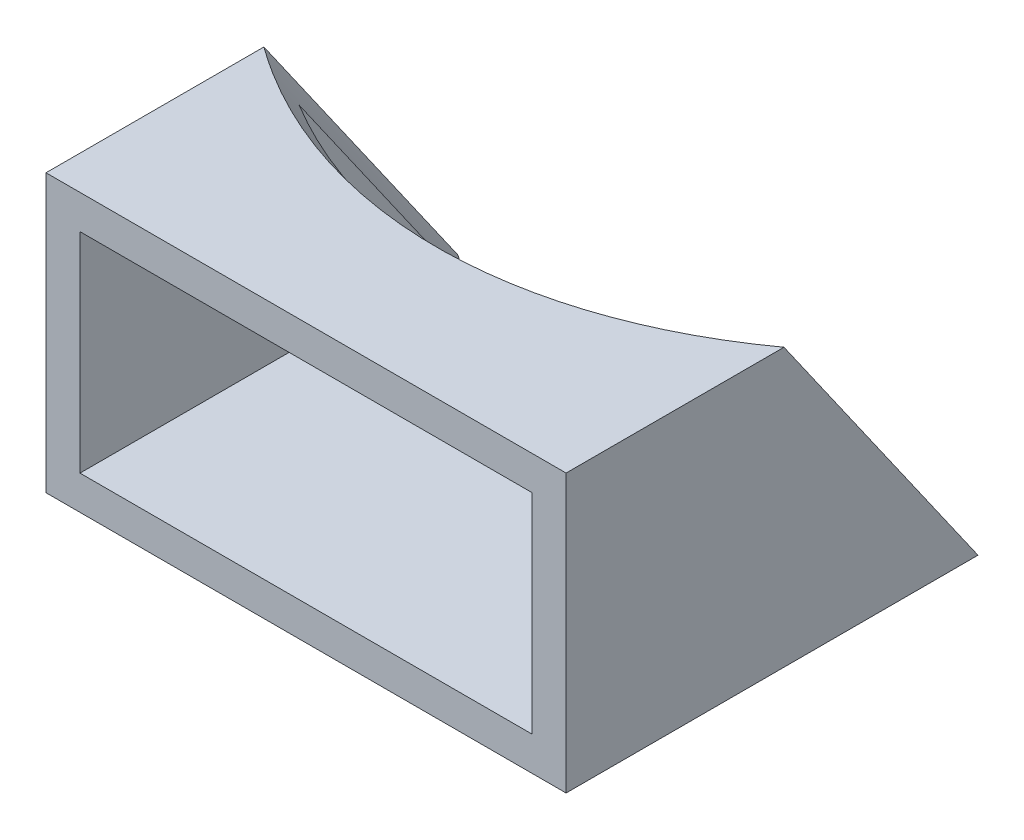
ISO-10303-21;
HEADER;
FILE_DESCRIPTION(('STEP AP214'),'2;1');
FILE_NAME('part.step','',(''),(''),'','','');
FILE_SCHEMA(('AUTOMOTIVE_DESIGN { 1 0 10303 214 1 1 1 1 }'));
ENDSEC;
DATA;
#1=APPLICATION_CONTEXT('core data for automotive mechanical design processes');
#2=APPLICATION_PROTOCOL_DEFINITION('international standard','automotive_design',2000,#1);
#3=PRODUCT_CONTEXT('',#1,'mechanical');
#4=PRODUCT('Part','Part','',(#3));
#5=PRODUCT_RELATED_PRODUCT_CATEGORY('part','',(#4));
#6=PRODUCT_DEFINITION_FORMATION('','',#4);
#7=PRODUCT_DEFINITION_CONTEXT('part definition',#1,'design');
#8=PRODUCT_DEFINITION('design','',#6,#7);
#9=PRODUCT_DEFINITION_SHAPE('','',#8);
#10=(LENGTH_UNIT() NAMED_UNIT(*) SI_UNIT(.MILLI.,.METRE.));
#11=(NAMED_UNIT(*) PLANE_ANGLE_UNIT() SI_UNIT($,.RADIAN.));
#12=(NAMED_UNIT(*) SI_UNIT($,.STERADIAN.) SOLID_ANGLE_UNIT());
#13=UNCERTAINTY_MEASURE_WITH_UNIT(LENGTH_MEASURE(1.E-05),#10,'distance_accuracy_value','');
#14=(GEOMETRIC_REPRESENTATION_CONTEXT(3) GLOBAL_UNCERTAINTY_ASSIGNED_CONTEXT((#13)) GLOBAL_UNIT_ASSIGNED_CONTEXT((#10,
#11,#12)) REPRESENTATION_CONTEXT('',''));
#15=CARTESIAN_POINT('',(0.,0.,0.));
#16=DIRECTION('',(0.,0.,1.));
#17=DIRECTION('',(1.,0.,0.));
#18=AXIS2_PLACEMENT_3D('',#15,#16,#17);
#19=CARTESIAN_POINT('',(-47.7798872534609,61.3523724595415,-130.001));
#20=DIRECTION('',(0.,-1.,0.));
#21=DIRECTION('',(0.,0.,-1.));
#22=AXIS2_PLACEMENT_3D('',#19,#20,#21);
#23=PLANE('',#22);
#24=CARTESIAN_POINT('',(-24.8342124637341,61.3523724595415,-83.6024771872845));
#25=DIRECTION('',(0.,-1.,0.));
#26=DIRECTION('',(0.,0.,-1.));
#27=AXIS2_PLACEMENT_3D('',#24,#25,#26);
#28=ELLIPSE('',#27,54.9348564942657,45.);
#29=CARTESIAN_POINT('',(-1.88853767400719,61.3523724595415,-36.3457897200542));
#30=VERTEX_POINT('',#29);
#31=CARTESIAN_POINT('',(-47.7798872534609,61.3523724595415,-36.3457897200542));
#32=VERTEX_POINT('',#31);
#33=EDGE_CURVE('E12',#30,#32,#28,.T.);
#34=ORIENTED_EDGE('',*,*,#33,.F.);
#35=DIRECTION('',(0.,0.,1.));
#36=VECTOR('',#35,1.);
#37=CARTESIAN_POINT('',(-1.88853767400719,61.3523724595415,-130.001));
#38=LINE('',#37,#36);
#39=CARTESIAN_POINT('',(-1.88853767400719,61.3523724595415,0.));
#40=VERTEX_POINT('',#39);
#41=EDGE_CURVE('E174',#30,#40,#38,.T.);
#42=ORIENTED_EDGE('',*,*,#41,.T.);
#43=DIRECTION('',(1.,0.,0.));
#44=VECTOR('',#43,1.);
#45=CARTESIAN_POINT('',(-47.7798872534609,61.3523724595415,0.));
#46=LINE('',#45,#44);
#47=CARTESIAN_POINT('',(-47.7798872534609,61.3523724595415,0.));
#48=VERTEX_POINT('',#47);
#49=EDGE_CURVE('E159',#48,#40,#46,.T.);
#50=ORIENTED_EDGE('',*,*,#49,.F.);
#51=DIRECTION('',(0.,0.,1.));
#52=VECTOR('',#51,1.);
#53=CARTESIAN_POINT('',(-47.7798872534609,61.3523724595415,-130.001));
#54=LINE('',#53,#52);
#55=EDGE_CURVE('E168',#32,#48,#54,.T.);
#56=ORIENTED_EDGE('',*,*,#55,.F.);
#57=EDGE_LOOP('',(#34,#42,#50,#56));
#58=FACE_BOUND('',#57,.T.);
#59=ADVANCED_FACE('F59',(#58),#23,.T.);
#60=CARTESIAN_POINT('',(-1.88853767400719,85.8051150064746,-130.001));
#61=DIRECTION('',(-1.,0.,0.));
#62=DIRECTION('',(0.,-1.,0.));
#63=AXIS2_PLACEMENT_3D('',#60,#61,#62);
#64=PLANE('',#63);
#65=ORIENTED_EDGE('',*,*,#41,.F.);
#66=DIRECTION('',(0.,-0.819152044288989,-0.57357643635105));
#67=VECTOR('',#66,1.);
#68=CARTESIAN_POINT('',(-1.88853767400718,3.32334527267329,-76.978151991276));
#69=LINE('',#68,#67);
#70=CARTESIAN_POINT('',(-1.88853767400718,85.8051150064746,-19.2237950587903));
#71=VERTEX_POINT('',#70);
#72=EDGE_CURVE('E179',#30,#71,#69,.F.);
#73=ORIENTED_EDGE('',*,*,#72,.T.);
#74=DIRECTION('',(0.,0.,1.));
#75=VECTOR('',#74,1.);
#76=CARTESIAN_POINT('',(-1.88853767400719,85.8051150064746,-130.001));
#77=LINE('',#76,#75);
#78=CARTESIAN_POINT('',(-1.88853767400719,85.8051150064746,0.));
#79=VERTEX_POINT('',#78);
#80=EDGE_CURVE('E172',#71,#79,#77,.T.);
#81=ORIENTED_EDGE('',*,*,#80,.T.);
#82=DIRECTION('',(0.,-1.,0.));
#83=VECTOR('',#82,1.);
#84=CARTESIAN_POINT('',(-1.88853767400719,85.8051150064746,0.));
#85=LINE('',#84,#83);
#86=EDGE_CURVE('E162',#79,#40,#85,.T.);
#87=ORIENTED_EDGE('',*,*,#86,.T.);
#88=EDGE_LOOP('',(#65,#73,#81,#87));
#89=FACE_BOUND('',#88,.T.);
#90=ADVANCED_FACE('F191',(#89),#64,.F.);
#91=CARTESIAN_POINT('',(-47.7798872534609,85.8051150064746,-130.001));
#92=DIRECTION('',(0.,-1.,0.));
#93=DIRECTION('',(0.,0.,-1.));
#94=AXIS2_PLACEMENT_3D('',#91,#92,#93);
#95=PLANE('',#94);
#96=ORIENTED_EDGE('',*,*,#80,.F.);
#97=CARTESIAN_POINT('',(-24.8342124637341,85.8051150064746,-66.4804825260206));
#98=DIRECTION('',(0.,-1.,0.));
#99=DIRECTION('',(0.,0.,-1.));
#100=AXIS2_PLACEMENT_3D('',#97,#98,#99);
#101=ELLIPSE('',#100,54.9348564942657,45.);
#102=CARTESIAN_POINT('',(-47.7798872534609,85.8051150064746,-19.2237950587903));
#103=VERTEX_POINT('',#102);
#104=EDGE_CURVE('E180',#71,#103,#101,.T.);
#105=ORIENTED_EDGE('',*,*,#104,.T.);
#106=DIRECTION('',(0.,0.,1.));
#107=VECTOR('',#106,1.);
#108=CARTESIAN_POINT('',(-47.7798872534609,85.8051150064746,-130.001));
#109=LINE('',#108,#107);
#110=CARTESIAN_POINT('',(-47.7798872534609,85.8051150064746,0.));
#111=VERTEX_POINT('',#110);
#112=EDGE_CURVE('E169',#103,#111,#109,.T.);
#113=ORIENTED_EDGE('',*,*,#112,.T.);
#114=DIRECTION('',(1.,0.,0.));
#115=VECTOR('',#114,1.);
#116=CARTESIAN_POINT('',(-47.7798872534609,85.8051150064746,0.));
#117=LINE('',#116,#115);
#118=EDGE_CURVE('E165',#111,#79,#117,.T.);
#119=ORIENTED_EDGE('',*,*,#118,.T.);
#120=EDGE_LOOP('',(#96,#105,#113,#119));
#121=FACE_BOUND('',#120,.T.);
#122=ADVANCED_FACE('F193',(#121),#95,.F.);
#123=CARTESIAN_POINT('',(-47.7798872534609,85.8051150064746,-130.001));
#124=DIRECTION('',(-1.,0.,0.));
#125=DIRECTION('',(0.,0.,1.));
#126=AXIS2_PLACEMENT_3D('',#123,#124,#125);
#127=PLANE('',#126);
#128=DIRECTION('',(0.,-0.819152044288989,-0.57357643635105));
#129=VECTOR('',#128,1.);
#130=CARTESIAN_POINT('',(-47.7798872534609,3.32334527267327,-76.978151991276));
#131=LINE('',#130,#129);
#132=EDGE_CURVE('E147',#32,#103,#131,.F.);
#133=ORIENTED_EDGE('',*,*,#132,.F.);
#134=ORIENTED_EDGE('',*,*,#55,.T.);
#135=DIRECTION('',(0.,-1.,0.));
#136=VECTOR('',#135,1.);
#137=CARTESIAN_POINT('',(-47.7798872534609,85.8051150064746,0.));
#138=LINE('',#137,#136);
#139=EDGE_CURVE('E131',#111,#48,#138,.T.);
#140=ORIENTED_EDGE('',*,*,#139,.F.);
#141=ORIENTED_EDGE('',*,*,#112,.F.);
#142=EDGE_LOOP('',(#133,#134,#140,#141));
#143=FACE_BOUND('',#142,.T.);
#144=ADVANCED_FACE('F61',(#143),#127,.T.);
#145=CARTESIAN_POINT('',(0.,0.,0.));
#146=DIRECTION('',(0.,0.,1.));
#147=DIRECTION('',(1.,0.,0.));
#148=AXIS2_PLACEMENT_3D('',#145,#146,#147);
#149=PLANE('',#148);
#150=ORIENTED_EDGE('',*,*,#139,.T.);
#151=ORIENTED_EDGE('',*,*,#49,.T.);
#152=ORIENTED_EDGE('',*,*,#86,.F.);
#153=ORIENTED_EDGE('',*,*,#118,.F.);
#154=EDGE_LOOP('',(#150,#151,#152,#153));
#155=FACE_BOUND('',#154,.T.);
#156=DIRECTION('',(0.,-1.,0.));
#157=VECTOR('',#156,1.);
#158=CARTESIAN_POINT('',(-44.7798872534609,82.8051150064745,0.));
#159=LINE('',#158,#157);
#160=CARTESIAN_POINT('',(-44.7798872534609,82.8051150064745,0.));
#161=VERTEX_POINT('',#160);
#162=CARTESIAN_POINT('',(-44.7798872534609,64.3523724595415,0.));
#163=VERTEX_POINT('',#162);
#164=EDGE_CURVE('E144',#161,#163,#159,.T.);
#165=ORIENTED_EDGE('',*,*,#164,.F.);
#166=DIRECTION('',(1.,0.,0.));
#167=VECTOR('',#166,1.);
#168=CARTESIAN_POINT('',(-44.7798872534609,82.8051150064745,0.));
#169=LINE('',#168,#167);
#170=CARTESIAN_POINT('',(-4.88853767400719,82.8051150064745,0.));
#171=VERTEX_POINT('',#170);
#172=EDGE_CURVE('E128',#161,#171,#169,.T.);
#173=ORIENTED_EDGE('',*,*,#172,.T.);
#174=DIRECTION('',(0.,-1.,0.));
#175=VECTOR('',#174,1.);
#176=CARTESIAN_POINT('',(-4.88853767400719,82.8051150064745,0.));
#177=LINE('',#176,#175);
#178=CARTESIAN_POINT('',(-4.88853767400717,64.3523724595415,0.));
#179=VERTEX_POINT('',#178);
#180=EDGE_CURVE('E135',#171,#179,#177,.T.);
#181=ORIENTED_EDGE('',*,*,#180,.T.);
#182=DIRECTION('',(1.,0.,0.));
#183=VECTOR('',#182,1.);
#184=CARTESIAN_POINT('',(-44.7798872534609,64.3523724595415,0.));
#185=LINE('',#184,#183);
#186=EDGE_CURVE('E140',#163,#179,#185,.T.);
#187=ORIENTED_EDGE('',*,*,#186,.F.);
#188=EDGE_LOOP('',(#165,#173,#181,#187));
#189=FACE_BOUND('',#188,.T.);
#190=ADVANCED_FACE('F142',(#155,#189),#149,.T.);
#191=CARTESIAN_POINT('',(-44.7798872534609,82.8051150064745,-130.001));
#192=DIRECTION('',(-1.,0.,0.));
#193=DIRECTION('',(0.,0.,1.));
#194=AXIS2_PLACEMENT_3D('',#191,#192,#193);
#195=PLANE('',#194);
#196=DIRECTION('',(0.,0.,1.));
#197=VECTOR('',#196,1.);
#198=CARTESIAN_POINT('',(-44.7798872534609,64.3523724595415,-130.001));
#199=LINE('',#198,#197);
#200=CARTESIAN_POINT('',(-44.7798872534609,64.3523724595416,-32.2580099295702));
#201=VERTEX_POINT('',#200);
#202=EDGE_CURVE('E154',#201,#163,#199,.T.);
#203=ORIENTED_EDGE('',*,*,#202,.F.);
#204=DIRECTION('',(0.,-0.819152044288989,-0.57357643635105));
#205=VECTOR('',#204,1.);
#206=CARTESIAN_POINT('',(-44.7798872534609,2.38968680542702,-75.6447495123003));
#207=LINE('',#206,#205);
#208=CARTESIAN_POINT('',(-44.7798872534609,82.8051150064745,-19.3372604975646));
#209=VERTEX_POINT('',#208);
#210=EDGE_CURVE('E171',#201,#209,#207,.F.);
#211=ORIENTED_EDGE('',*,*,#210,.T.);
#212=DIRECTION('',(0.,0.,1.));
#213=VECTOR('',#212,1.);
#214=CARTESIAN_POINT('',(-44.7798872534609,82.8051150064745,-130.001));
#215=LINE('',#214,#213);
#216=EDGE_CURVE('E152',#209,#161,#215,.T.);
#217=ORIENTED_EDGE('',*,*,#216,.T.);
#218=ORIENTED_EDGE('',*,*,#164,.T.);
#219=EDGE_LOOP('',(#203,#211,#217,#218));
#220=FACE_BOUND('',#219,.T.);
#221=ADVANCED_FACE('F208',(#220),#195,.F.);
#222=CARTESIAN_POINT('',(-44.7798872534609,64.3523724595415,-130.001));
#223=DIRECTION('',(0.,-1.,0.));
#224=DIRECTION('',(0.,0.,-1.));
#225=AXIS2_PLACEMENT_3D('',#222,#223,#224);
#226=PLANE('',#225);
#227=DIRECTION('',(0.,0.,1.));
#228=VECTOR('',#227,1.);
#229=CARTESIAN_POINT('',(-4.88853767400717,64.3523724595415,-130.001));
#230=LINE('',#229,#228);
#231=CARTESIAN_POINT('',(-4.8885376740072,64.3523724595416,-32.2580099295702));
#232=VERTEX_POINT('',#231);
#233=EDGE_CURVE('E132',#232,#179,#230,.T.);
#234=ORIENTED_EDGE('',*,*,#233,.F.);
#235=CARTESIAN_POINT('',(-24.8342124637341,64.3523724595415,-81.5018545726554));
#236=DIRECTION('',(0.,-1.,0.));
#237=DIRECTION('',(0.,0.,-1.));
#238=AXIS2_PLACEMENT_3D('',#235,#236,#237);
#239=ELLIPSE('',#238,54.9348564942657,45.);
#240=EDGE_CURVE('E68',#232,#201,#239,.T.);
#241=ORIENTED_EDGE('',*,*,#240,.T.);
#242=ORIENTED_EDGE('',*,*,#202,.T.);
#243=ORIENTED_EDGE('',*,*,#186,.T.);
#244=EDGE_LOOP('',(#234,#241,#242,#243));
#245=FACE_BOUND('',#244,.T.);
#246=ADVANCED_FACE('F221',(#245),#226,.F.);
#247=CARTESIAN_POINT('',(-4.88853767400719,82.8051150064745,-130.001));
#248=DIRECTION('',(-1.,0.,0.));
#249=DIRECTION('',(0.,-1.,0.));
#250=AXIS2_PLACEMENT_3D('',#247,#248,#249);
#251=PLANE('',#250);
#252=DIRECTION('',(0.,-0.819152044288989,-0.57357643635105));
#253=VECTOR('',#252,1.);
#254=CARTESIAN_POINT('',(-4.88853767400713,2.38968680542706,-75.6447495123004));
#255=LINE('',#254,#253);
#256=CARTESIAN_POINT('',(-4.8885376740072,82.8051150064746,-19.3372604975646));
#257=VERTEX_POINT('',#256);
#258=EDGE_CURVE('E76',#232,#257,#255,.F.);
#259=ORIENTED_EDGE('',*,*,#258,.F.);
#260=ORIENTED_EDGE('',*,*,#233,.T.);
#261=ORIENTED_EDGE('',*,*,#180,.F.);
#262=DIRECTION('',(0.,0.,1.));
#263=VECTOR('',#262,1.);
#264=CARTESIAN_POINT('',(-4.88853767400719,82.8051150064745,-130.001));
#265=LINE('',#264,#263);
#266=EDGE_CURVE('E123',#257,#171,#265,.T.);
#267=ORIENTED_EDGE('',*,*,#266,.F.);
#268=EDGE_LOOP('',(#259,#260,#261,#267));
#269=FACE_BOUND('',#268,.T.);
#270=ADVANCED_FACE('F136',(#269),#251,.T.);
#271=CARTESIAN_POINT('',(-44.7798872534609,82.8051150064745,-130.001));
#272=DIRECTION('',(0.,-1.,0.));
#273=DIRECTION('',(0.,0.,-1.));
#274=AXIS2_PLACEMENT_3D('',#271,#272,#273);
#275=PLANE('',#274);
#276=CARTESIAN_POINT('',(-24.8342124637341,82.8051150064745,-68.5811051406497));
#277=DIRECTION('',(0.,-1.,0.));
#278=DIRECTION('',(0.,0.,-1.));
#279=AXIS2_PLACEMENT_3D('',#276,#277,#278);
#280=ELLIPSE('',#279,54.9348564942657,45.);
#281=EDGE_CURVE('E63',#257,#209,#280,.T.);
#282=ORIENTED_EDGE('',*,*,#281,.F.);
#283=ORIENTED_EDGE('',*,*,#266,.T.);
#284=ORIENTED_EDGE('',*,*,#172,.F.);
#285=ORIENTED_EDGE('',*,*,#216,.F.);
#286=EDGE_LOOP('',(#282,#283,#284,#285));
#287=FACE_BOUND('',#286,.T.);
#288=ADVANCED_FACE('F125',(#287),#275,.T.);
#289=CARTESIAN_POINT('',(-24.8342124637341,25.5267255205445,-108.68786523521));
#290=DIRECTION('',(0.,-0.819152044288989,-0.57357643635105));
#291=DIRECTION('',(0.,0.57357643635105,-0.819152044288989));
#292=AXIS2_PLACEMENT_3D('',#289,#290,#291);
#293=CYLINDRICAL_SURFACE('',#292,45.);
#294=ORIENTED_EDGE('',*,*,#132,.T.);
#295=ORIENTED_EDGE('',*,*,#104,.F.);
#296=ORIENTED_EDGE('',*,*,#72,.F.);
#297=ORIENTED_EDGE('',*,*,#33,.T.);
#298=EDGE_LOOP('',(#294,#295,#296,#297));
#299=FACE_BOUND('',#298,.T.);
#300=ORIENTED_EDGE('',*,*,#281,.T.);
#301=ORIENTED_EDGE('',*,*,#210,.F.);
#302=ORIENTED_EDGE('',*,*,#240,.F.);
#303=ORIENTED_EDGE('',*,*,#258,.T.);
#304=EDGE_LOOP('',(#300,#301,#302,#303));
#305=FACE_BOUND('',#304,.T.);
#306=ADVANCED_FACE('F201',(#299,#305),#293,.F.);
#307=CLOSED_SHELL('',(#59,#90,#122,#144,#190,#221,#246,#270,#288,#306));
#308=MANIFOLD_SOLID_BREP('B2',#307);
#309=ADVANCED_BREP_SHAPE_REPRESENTATION('',(#18,#308),#14);
#310=SHAPE_DEFINITION_REPRESENTATION(#9,#309);
ENDSEC;
END-ISO-10303-21;
